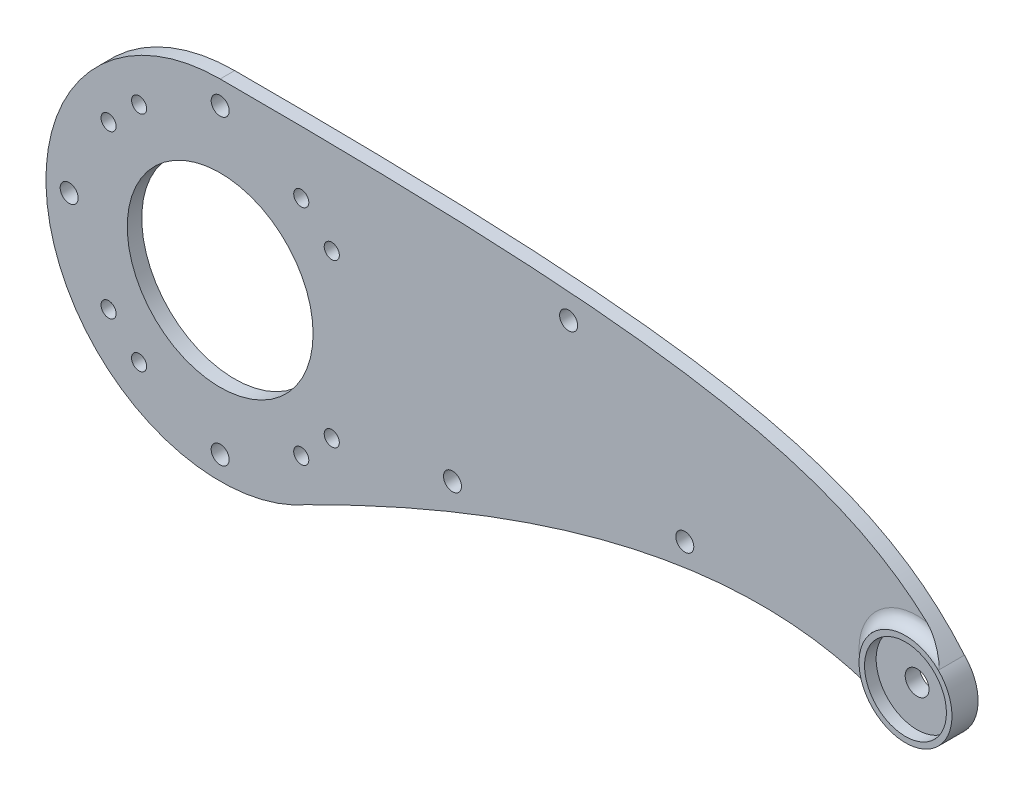
ISO-10303-21;
HEADER;
FILE_DESCRIPTION(('STEP AP214'),'2;1');
FILE_NAME('part.step','',(''),(''),'','','');
FILE_SCHEMA(('AUTOMOTIVE_DESIGN { 1 0 10303 214 1 1 1 1 }'));
ENDSEC;
DATA;
#1=APPLICATION_CONTEXT('core data for automotive mechanical design processes');
#2=APPLICATION_PROTOCOL_DEFINITION('international standard','automotive_design',2000,#1);
#3=PRODUCT_CONTEXT('',#1,'mechanical');
#4=PRODUCT('Part','Part','',(#3));
#5=PRODUCT_RELATED_PRODUCT_CATEGORY('part','',(#4));
#6=PRODUCT_DEFINITION_FORMATION('','',#4);
#7=PRODUCT_DEFINITION_CONTEXT('part definition',#1,'design');
#8=PRODUCT_DEFINITION('design','',#6,#7);
#9=PRODUCT_DEFINITION_SHAPE('','',#8);
#10=(LENGTH_UNIT() NAMED_UNIT(*) SI_UNIT(.MILLI.,.METRE.));
#11=(NAMED_UNIT(*) PLANE_ANGLE_UNIT() SI_UNIT($,.RADIAN.));
#12=(NAMED_UNIT(*) SI_UNIT($,.STERADIAN.) SOLID_ANGLE_UNIT());
#13=UNCERTAINTY_MEASURE_WITH_UNIT(LENGTH_MEASURE(1.E-05),#10,'distance_accuracy_value','');
#14=(GEOMETRIC_REPRESENTATION_CONTEXT(3) GLOBAL_UNCERTAINTY_ASSIGNED_CONTEXT((#13)) GLOBAL_UNIT_ASSIGNED_CONTEXT((#10,
#11,#12)) REPRESENTATION_CONTEXT('',''));
#15=CARTESIAN_POINT('',(0.,0.,0.));
#16=DIRECTION('',(0.,0.,1.));
#17=DIRECTION('',(1.,0.,0.));
#18=AXIS2_PLACEMENT_3D('',#15,#16,#17);
#19=CARTESIAN_POINT('',(86.7847382513976,24.9953267195614,2.5));
#20=DIRECTION('',(0.,0.,1.));
#21=DIRECTION('',(1.,0.,0.));
#22=AXIS2_PLACEMENT_3D('',#19,#20,#21);
#23=PLANE('',#22);
#24=CARTESIAN_POINT('',(120.,0.,2.5));
#25=DIRECTION('',(0.,0.,1.));
#26=DIRECTION('',(1.,0.,0.));
#27=AXIS2_PLACEMENT_3D('',#24,#25,#26);
#28=CIRCLE('',#27,2.04999999999999);
#29=CARTESIAN_POINT('',(122.05,0.,2.5));
#30=VERTEX_POINT('',#29);
#31=EDGE_CURVE('E300',#30,#30,#28,.T.);
#32=ORIENTED_EDGE('',*,*,#31,.F.);
#33=EDGE_LOOP('',(#32));
#34=FACE_BOUND('',#33,.T.);
#35=CARTESIAN_POINT('',(120.,0.,2.5));
#36=DIRECTION('',(0.,0.,1.));
#37=DIRECTION('',(1.,0.,0.));
#38=AXIS2_PLACEMENT_3D('',#35,#36,#37);
#39=CIRCLE('',#38,7.05000000000001);
#40=CARTESIAN_POINT('',(127.05,0.,2.5));
#41=VERTEX_POINT('',#40);
#42=EDGE_CURVE('E200',#41,#41,#39,.T.);
#43=ORIENTED_EDGE('',*,*,#42,.T.);
#44=EDGE_LOOP('',(#43));
#45=FACE_BOUND('',#44,.T.);
#46=ADVANCED_FACE('F46',(#34,#45),#23,.T.);
#47=CARTESIAN_POINT('',(15.0000000000001,-25.9807621135331,2.5));
#48=CARTESIAN_POINT('',(82.0010347276407,7.72178000758146,2.5));
#49=CARTESIAN_POINT('',(114.343145750508,-5.65685424949234,2.5));
#50=B_SPLINE_CURVE_WITH_KNOTS('',2,(#47,#48,#49),.UNSPECIFIED.,.F.,.F.,(3,3),(0.,1.),.UNSPECIFIED.);
#51=CARTESIAN_POINT('',(15.0000000000001,-25.9807621135331,2.5));
#52=VERTEX_POINT('',#51);
#53=CARTESIAN_POINT('',(111.041115038127,-4.44278969116528,2.5));
#54=VERTEX_POINT('',#53);
#55=EDGE_CURVE('E116',#52,#54,#50,.T.);
#56=ORIENTED_EDGE('',*,*,#55,.T.);
#57=CARTESIAN_POINT('',(120.,0.,2.5));
#58=DIRECTION('',(0.,0.,1.));
#59=DIRECTION('',(1.,0.,0.));
#60=AXIS2_PLACEMENT_3D('',#57,#58,#59);
#61=CIRCLE('',#60,9.99999999999999);
#62=CARTESIAN_POINT('',(121.63931092164,9.86471792309334,2.5));
#63=VERTEX_POINT('',#62);
#64=EDGE_CURVE('E73',#54,#63,#61,.F.);
#65=ORIENTED_EDGE('',*,*,#64,.T.);
#66=CARTESIAN_POINT('',(125.656854249492,5.65685424949235,2.5));
#67=CARTESIAN_POINT('',(109.540350587229,24.7685865023329,2.5));
#68=CARTESIAN_POINT('',(80.,30.,2.5));
#69=CARTESIAN_POINT('',(0.,30.,2.5));
#70=B_SPLINE_CURVE_WITH_KNOTS('',3,(#66,#67,#68,#69),.UNSPECIFIED.,.F.,.F.,(4,4),(0.,1.),.UNSPECIFIED.);
#71=CARTESIAN_POINT('',(0.,30.,2.5));
#72=VERTEX_POINT('',#71);
#73=EDGE_CURVE('E96',#63,#72,#70,.T.);
#74=ORIENTED_EDGE('',*,*,#73,.T.);
#75=CARTESIAN_POINT('',(0.,0.,2.5));
#76=DIRECTION('',(0.,0.,1.));
#77=DIRECTION('',(1.,0.,0.));
#78=AXIS2_PLACEMENT_3D('',#75,#76,#77);
#79=CIRCLE('',#78,30.);
#80=EDGE_CURVE('E100',#72,#52,#79,.T.);
#81=ORIENTED_EDGE('',*,*,#80,.T.);
#82=EDGE_LOOP('',(#56,#65,#74,#81));
#83=FACE_BOUND('',#82,.T.);
#84=CARTESIAN_POINT('',(80.,1.,2.5));
#85=DIRECTION('',(0.,0.,1.));
#86=DIRECTION('',(1.,0.,0.));
#87=AXIS2_PLACEMENT_3D('',#84,#85,#86);
#88=CIRCLE('',#87,1.54999999999999);
#89=CARTESIAN_POINT('',(81.55,1.,2.5));
#90=VERTEX_POINT('',#89);
#91=EDGE_CURVE('E212',#90,#90,#88,.T.);
#92=ORIENTED_EDGE('',*,*,#91,.F.);
#93=EDGE_LOOP('',(#92));
#94=FACE_BOUND('',#93,.T.);
#95=CARTESIAN_POINT('',(0.,26.,2.5));
#96=DIRECTION('',(0.,0.,1.));
#97=DIRECTION('',(1.,0.,0.));
#98=AXIS2_PLACEMENT_3D('',#95,#96,#97);
#99=CIRCLE('',#98,1.55);
#100=CARTESIAN_POINT('',(1.55,26.,2.5));
#101=VERTEX_POINT('',#100);
#102=EDGE_CURVE('E228',#101,#101,#99,.T.);
#103=ORIENTED_EDGE('',*,*,#102,.F.);
#104=EDGE_LOOP('',(#103));
#105=FACE_BOUND('',#104,.T.);
#106=CARTESIAN_POINT('',(-19.2141536164048,13.9598997419465,2.5));
#107=DIRECTION('',(0.,0.,1.));
#108=DIRECTION('',(1.,0.,0.));
#109=AXIS2_PLACEMENT_3D('',#106,#107,#108);
#110=CIRCLE('',#109,1.3);
#111=CARTESIAN_POINT('',(-17.9141536164048,13.9598997419465,2.5));
#112=VERTEX_POINT('',#111);
#113=EDGE_CURVE('E244',#112,#112,#110,.T.);
#114=ORIENTED_EDGE('',*,*,#113,.F.);
#115=EDGE_LOOP('',(#114));
#116=FACE_BOUND('',#115,.T.);
#117=CARTESIAN_POINT('',(-13.9598997419464,-19.2141536164049,2.5));
#118=DIRECTION('',(0.,0.,1.));
#119=DIRECTION('',(1.,0.,0.));
#120=AXIS2_PLACEMENT_3D('',#117,#118,#119);
#121=CIRCLE('',#120,1.3);
#122=CARTESIAN_POINT('',(-12.6598997419464,-19.2141536164049,2.5));
#123=VERTEX_POINT('',#122);
#124=EDGE_CURVE('E260',#123,#123,#121,.T.);
#125=ORIENTED_EDGE('',*,*,#124,.F.);
#126=EDGE_LOOP('',(#125));
#127=FACE_BOUND('',#126,.T.);
#128=CARTESIAN_POINT('',(19.2141536164049,-13.9598997419463,2.5));
#129=DIRECTION('',(0.,0.,1.));
#130=DIRECTION('',(1.,0.,0.));
#131=AXIS2_PLACEMENT_3D('',#128,#129,#130);
#132=CIRCLE('',#131,1.3);
#133=CARTESIAN_POINT('',(20.5141536164049,-13.9598997419463,2.5));
#134=VERTEX_POINT('',#133);
#135=EDGE_CURVE('E276',#134,#134,#132,.T.);
#136=ORIENTED_EDGE('',*,*,#135,.F.);
#137=EDGE_LOOP('',(#136));
#138=FACE_BOUND('',#137,.T.);
#139=CARTESIAN_POINT('',(-26.,0.,2.5));
#140=DIRECTION('',(0.,0.,1.));
#141=DIRECTION('',(1.,0.,0.));
#142=AXIS2_PLACEMENT_3D('',#139,#140,#141);
#143=CIRCLE('',#142,1.55);
#144=CARTESIAN_POINT('',(-24.45,0.,2.5));
#145=VERTEX_POINT('',#144);
#146=EDGE_CURVE('E292',#145,#145,#143,.T.);
#147=ORIENTED_EDGE('',*,*,#146,.F.);
#148=EDGE_LOOP('',(#147));
#149=FACE_BOUND('',#148,.T.);
#150=CARTESIAN_POINT('',(0.,0.,2.5));
#151=DIRECTION('',(0.,0.,1.));
#152=DIRECTION('',(1.,0.,0.));
#153=AXIS2_PLACEMENT_3D('',#150,#151,#152);
#154=CIRCLE('',#153,16.);
#155=CARTESIAN_POINT('',(16.,0.,2.5));
#156=VERTEX_POINT('',#155);
#157=EDGE_CURVE('E308',#156,#156,#154,.T.);
#158=ORIENTED_EDGE('',*,*,#157,.F.);
#159=EDGE_LOOP('',(#158));
#160=FACE_BOUND('',#159,.T.);
#161=CARTESIAN_POINT('',(19.2141536164051,13.9598997419461,2.5));
#162=DIRECTION('',(0.,0.,1.));
#163=DIRECTION('',(1.,0.,0.));
#164=AXIS2_PLACEMENT_3D('',#161,#162,#163);
#165=CIRCLE('',#164,1.3);
#166=CARTESIAN_POINT('',(20.5141536164051,13.9598997419461,2.5));
#167=VERTEX_POINT('',#166);
#168=EDGE_CURVE('E158',#167,#167,#165,.T.);
#169=ORIENTED_EDGE('',*,*,#168,.F.);
#170=EDGE_LOOP('',(#169));
#171=FACE_BOUND('',#170,.T.);
#172=CARTESIAN_POINT('',(13.9598997419463,19.214153616405,2.5));
#173=DIRECTION('',(0.,0.,1.));
#174=DIRECTION('',(1.,0.,0.));
#175=AXIS2_PLACEMENT_3D('',#172,#173,#174);
#176=CIRCLE('',#175,1.3);
#177=CARTESIAN_POINT('',(15.2598997419463,19.214153616405,2.5));
#178=VERTEX_POINT('',#177);
#179=EDGE_CURVE('E316',#178,#178,#176,.T.);
#180=ORIENTED_EDGE('',*,*,#179,.F.);
#181=EDGE_LOOP('',(#180));
#182=FACE_BOUND('',#181,.T.);
#183=CARTESIAN_POINT('',(13.9598997419461,-19.2141536164051,2.5));
#184=DIRECTION('',(0.,0.,1.));
#185=DIRECTION('',(1.,0.,0.));
#186=AXIS2_PLACEMENT_3D('',#183,#184,#185);
#187=CIRCLE('',#186,1.3);
#188=CARTESIAN_POINT('',(15.2598997419461,-19.2141536164051,2.5));
#189=VERTEX_POINT('',#188);
#190=EDGE_CURVE('E284',#189,#189,#187,.T.);
#191=ORIENTED_EDGE('',*,*,#190,.F.);
#192=EDGE_LOOP('',(#191));
#193=FACE_BOUND('',#192,.T.);
#194=CARTESIAN_POINT('',(-19.2141536164052,-13.959899741946,2.5));
#195=DIRECTION('',(0.,0.,1.));
#196=DIRECTION('',(1.,0.,0.));
#197=AXIS2_PLACEMENT_3D('',#194,#195,#196);
#198=CIRCLE('',#197,1.3);
#199=CARTESIAN_POINT('',(-17.9141536164052,-13.959899741946,2.5));
#200=VERTEX_POINT('',#199);
#201=EDGE_CURVE('E268',#200,#200,#198,.T.);
#202=ORIENTED_EDGE('',*,*,#201,.F.);
#203=EDGE_LOOP('',(#202));
#204=FACE_BOUND('',#203,.T.);
#205=CARTESIAN_POINT('',(-13.9598997419459,19.2141536164052,2.5));
#206=DIRECTION('',(0.,0.,1.));
#207=DIRECTION('',(1.,0.,0.));
#208=AXIS2_PLACEMENT_3D('',#205,#206,#207);
#209=CIRCLE('',#208,1.3);
#210=CARTESIAN_POINT('',(-12.6598997419459,19.2141536164052,2.5));
#211=VERTEX_POINT('',#210);
#212=EDGE_CURVE('E252',#211,#211,#209,.T.);
#213=ORIENTED_EDGE('',*,*,#212,.F.);
#214=EDGE_LOOP('',(#213));
#215=FACE_BOUND('',#214,.T.);
#216=CARTESIAN_POINT('',(40.,-10.,2.5));
#217=DIRECTION('',(0.,0.,1.));
#218=DIRECTION('',(1.,0.,0.));
#219=AXIS2_PLACEMENT_3D('',#216,#217,#218);
#220=CIRCLE('',#219,1.55);
#221=CARTESIAN_POINT('',(41.55,-10.,2.5));
#222=VERTEX_POINT('',#221);
#223=EDGE_CURVE('E236',#222,#222,#220,.T.);
#224=ORIENTED_EDGE('',*,*,#223,.F.);
#225=EDGE_LOOP('',(#224));
#226=FACE_BOUND('',#225,.T.);
#227=CARTESIAN_POINT('',(-2.72620909703935E-13,-26.,2.5));
#228=DIRECTION('',(0.,0.,1.));
#229=DIRECTION('',(1.,0.,0.));
#230=AXIS2_PLACEMENT_3D('',#227,#228,#229);
#231=CIRCLE('',#230,1.55);
#232=CARTESIAN_POINT('',(1.54999999999972,-26.,2.5));
#233=VERTEX_POINT('',#232);
#234=EDGE_CURVE('E220',#233,#233,#231,.T.);
#235=ORIENTED_EDGE('',*,*,#234,.F.);
#236=EDGE_LOOP('',(#235));
#237=FACE_BOUND('',#236,.T.);
#238=CARTESIAN_POINT('',(60.,24.,2.5));
#239=DIRECTION('',(0.,0.,1.));
#240=DIRECTION('',(1.,0.,0.));
#241=AXIS2_PLACEMENT_3D('',#238,#239,#240);
#242=CIRCLE('',#241,1.54999999999999);
#243=CARTESIAN_POINT('',(61.55,24.,2.5));
#244=VERTEX_POINT('',#243);
#245=EDGE_CURVE('E204',#244,#244,#242,.T.);
#246=ORIENTED_EDGE('',*,*,#245,.F.);
#247=EDGE_LOOP('',(#246));
#248=FACE_BOUND('',#247,.T.);
#249=ADVANCED_FACE('F98',(#83,#94,#105,#116,#127,#138,#149,#160,#171,#182,#193,#204,#215,#226,
#237,#248),#23,.T.);
#250=CARTESIAN_POINT('',(86.7847382513976,24.9953267195614,0.));
#251=DIRECTION('',(0.,0.,1.));
#252=DIRECTION('',(1.,0.,0.));
#253=AXIS2_PLACEMENT_3D('',#250,#251,#252);
#254=PLANE('',#253);
#255=CARTESIAN_POINT('',(125.656854249492,5.65685424949235,0.));
#256=CARTESIAN_POINT('',(109.540350587229,24.7685865023329,0.));
#257=CARTESIAN_POINT('',(80.,30.,0.));
#258=CARTESIAN_POINT('',(0.,30.,0.));
#259=B_SPLINE_CURVE_WITH_KNOTS('',3,(#255,#256,#257,#258),.UNSPECIFIED.,.F.,.F.,(4,4),(0.,1.),.UNSPECIFIED.);
#260=CARTESIAN_POINT('',(125.656854249492,5.65685424949235,0.));
#261=VERTEX_POINT('',#260);
#262=CARTESIAN_POINT('',(0.,30.,0.));
#263=VERTEX_POINT('',#262);
#264=EDGE_CURVE('E121',#261,#263,#259,.T.);
#265=ORIENTED_EDGE('',*,*,#264,.F.);
#266=CARTESIAN_POINT('',(120.,0.,0.));
#267=DIRECTION('',(0.,0.,1.));
#268=DIRECTION('',(-1.,0.,0.));
#269=AXIS2_PLACEMENT_3D('',#266,#267,#268);
#270=CIRCLE('',#269,7.99999999999999);
#271=CARTESIAN_POINT('',(114.343145750508,-5.65685424949234,0.));
#272=VERTEX_POINT('',#271);
#273=EDGE_CURVE('E106',#272,#261,#270,.T.);
#274=ORIENTED_EDGE('',*,*,#273,.F.);
#275=CARTESIAN_POINT('',(15.0000000000001,-25.9807621135331,0.));
#276=CARTESIAN_POINT('',(82.0010347276407,7.72178000758146,0.));
#277=CARTESIAN_POINT('',(114.343145750508,-5.65685424949234,0.));
#278=B_SPLINE_CURVE_WITH_KNOTS('',2,(#275,#276,#277),.UNSPECIFIED.,.F.,.F.,(3,3),(0.,1.),.UNSPECIFIED.);
#279=CARTESIAN_POINT('',(15.0000000000001,-25.9807621135331,0.));
#280=VERTEX_POINT('',#279);
#281=EDGE_CURVE('E164',#280,#272,#278,.T.);
#282=ORIENTED_EDGE('',*,*,#281,.F.);
#283=CARTESIAN_POINT('',(0.,0.,0.));
#284=DIRECTION('',(0.,0.,1.));
#285=DIRECTION('',(1.,0.,0.));
#286=AXIS2_PLACEMENT_3D('',#283,#284,#285);
#287=CIRCLE('',#286,30.);
#288=EDGE_CURVE('E157',#263,#280,#287,.T.);
#289=ORIENTED_EDGE('',*,*,#288,.F.);
#290=EDGE_LOOP('',(#265,#274,#282,#289));
#291=FACE_BOUND('',#290,.T.);
#292=CARTESIAN_POINT('',(19.2141536164051,13.9598997419461,0.));
#293=DIRECTION('',(0.,0.,1.));
#294=DIRECTION('',(1.,0.,0.));
#295=AXIS2_PLACEMENT_3D('',#292,#293,#294);
#296=CIRCLE('',#295,1.3);
#297=CARTESIAN_POINT('',(20.5141536164051,13.9598997419461,0.));
#298=VERTEX_POINT('',#297);
#299=EDGE_CURVE('E320',#298,#298,#296,.T.);
#300=ORIENTED_EDGE('',*,*,#299,.T.);
#301=EDGE_LOOP('',(#300));
#302=FACE_BOUND('',#301,.T.);
#303=CARTESIAN_POINT('',(13.9598997419463,19.214153616405,0.));
#304=DIRECTION('',(0.,0.,1.));
#305=DIRECTION('',(1.,0.,0.));
#306=AXIS2_PLACEMENT_3D('',#303,#304,#305);
#307=CIRCLE('',#306,1.3);
#308=CARTESIAN_POINT('',(15.2598997419463,19.214153616405,0.));
#309=VERTEX_POINT('',#308);
#310=EDGE_CURVE('E312',#309,#309,#307,.T.);
#311=ORIENTED_EDGE('',*,*,#310,.T.);
#312=EDGE_LOOP('',(#311));
#313=FACE_BOUND('',#312,.T.);
#314=CARTESIAN_POINT('',(0.,0.,0.));
#315=DIRECTION('',(0.,0.,1.));
#316=DIRECTION('',(1.,0.,0.));
#317=AXIS2_PLACEMENT_3D('',#314,#315,#316);
#318=CIRCLE('',#317,16.);
#319=CARTESIAN_POINT('',(16.,0.,0.));
#320=VERTEX_POINT('',#319);
#321=EDGE_CURVE('E304',#320,#320,#318,.T.);
#322=ORIENTED_EDGE('',*,*,#321,.T.);
#323=EDGE_LOOP('',(#322));
#324=FACE_BOUND('',#323,.T.);
#325=CARTESIAN_POINT('',(120.,0.,0.));
#326=DIRECTION('',(0.,0.,1.));
#327=DIRECTION('',(1.,0.,0.));
#328=AXIS2_PLACEMENT_3D('',#325,#326,#327);
#329=CIRCLE('',#328,2.04999999999999);
#330=CARTESIAN_POINT('',(122.05,0.,0.));
#331=VERTEX_POINT('',#330);
#332=EDGE_CURVE('E296',#331,#331,#329,.T.);
#333=ORIENTED_EDGE('',*,*,#332,.T.);
#334=EDGE_LOOP('',(#333));
#335=FACE_BOUND('',#334,.T.);
#336=CARTESIAN_POINT('',(-26.,0.,0.));
#337=DIRECTION('',(0.,0.,1.));
#338=DIRECTION('',(1.,0.,0.));
#339=AXIS2_PLACEMENT_3D('',#336,#337,#338);
#340=CIRCLE('',#339,1.55);
#341=CARTESIAN_POINT('',(-24.45,0.,0.));
#342=VERTEX_POINT('',#341);
#343=EDGE_CURVE('E288',#342,#342,#340,.T.);
#344=ORIENTED_EDGE('',*,*,#343,.T.);
#345=EDGE_LOOP('',(#344));
#346=FACE_BOUND('',#345,.T.);
#347=CARTESIAN_POINT('',(13.9598997419461,-19.2141536164051,0.));
#348=DIRECTION('',(0.,0.,1.));
#349=DIRECTION('',(1.,0.,0.));
#350=AXIS2_PLACEMENT_3D('',#347,#348,#349);
#351=CIRCLE('',#350,1.3);
#352=CARTESIAN_POINT('',(15.2598997419461,-19.2141536164051,0.));
#353=VERTEX_POINT('',#352);
#354=EDGE_CURVE('E280',#353,#353,#351,.T.);
#355=ORIENTED_EDGE('',*,*,#354,.T.);
#356=EDGE_LOOP('',(#355));
#357=FACE_BOUND('',#356,.T.);
#358=CARTESIAN_POINT('',(19.2141536164049,-13.9598997419463,0.));
#359=DIRECTION('',(0.,0.,1.));
#360=DIRECTION('',(1.,0.,0.));
#361=AXIS2_PLACEMENT_3D('',#358,#359,#360);
#362=CIRCLE('',#361,1.3);
#363=CARTESIAN_POINT('',(20.5141536164049,-13.9598997419463,0.));
#364=VERTEX_POINT('',#363);
#365=EDGE_CURVE('E272',#364,#364,#362,.T.);
#366=ORIENTED_EDGE('',*,*,#365,.T.);
#367=EDGE_LOOP('',(#366));
#368=FACE_BOUND('',#367,.T.);
#369=CARTESIAN_POINT('',(-19.2141536164052,-13.959899741946,0.));
#370=DIRECTION('',(0.,0.,1.));
#371=DIRECTION('',(1.,0.,0.));
#372=AXIS2_PLACEMENT_3D('',#369,#370,#371);
#373=CIRCLE('',#372,1.3);
#374=CARTESIAN_POINT('',(-17.9141536164052,-13.959899741946,0.));
#375=VERTEX_POINT('',#374);
#376=EDGE_CURVE('E264',#375,#375,#373,.T.);
#377=ORIENTED_EDGE('',*,*,#376,.T.);
#378=EDGE_LOOP('',(#377));
#379=FACE_BOUND('',#378,.T.);
#380=CARTESIAN_POINT('',(-13.9598997419464,-19.2141536164049,0.));
#381=DIRECTION('',(0.,0.,1.));
#382=DIRECTION('',(1.,0.,0.));
#383=AXIS2_PLACEMENT_3D('',#380,#381,#382);
#384=CIRCLE('',#383,1.3);
#385=CARTESIAN_POINT('',(-12.6598997419464,-19.2141536164049,0.));
#386=VERTEX_POINT('',#385);
#387=EDGE_CURVE('E256',#386,#386,#384,.T.);
#388=ORIENTED_EDGE('',*,*,#387,.T.);
#389=EDGE_LOOP('',(#388));
#390=FACE_BOUND('',#389,.T.);
#391=CARTESIAN_POINT('',(-13.9598997419459,19.2141536164052,0.));
#392=DIRECTION('',(0.,0.,1.));
#393=DIRECTION('',(1.,0.,0.));
#394=AXIS2_PLACEMENT_3D('',#391,#392,#393);
#395=CIRCLE('',#394,1.3);
#396=CARTESIAN_POINT('',(-12.6598997419459,19.2141536164052,0.));
#397=VERTEX_POINT('',#396);
#398=EDGE_CURVE('E248',#397,#397,#395,.T.);
#399=ORIENTED_EDGE('',*,*,#398,.T.);
#400=EDGE_LOOP('',(#399));
#401=FACE_BOUND('',#400,.T.);
#402=CARTESIAN_POINT('',(-19.2141536164048,13.9598997419465,0.));
#403=DIRECTION('',(0.,0.,1.));
#404=DIRECTION('',(1.,0.,0.));
#405=AXIS2_PLACEMENT_3D('',#402,#403,#404);
#406=CIRCLE('',#405,1.3);
#407=CARTESIAN_POINT('',(-17.9141536164048,13.9598997419465,0.));
#408=VERTEX_POINT('',#407);
#409=EDGE_CURVE('E240',#408,#408,#406,.T.);
#410=ORIENTED_EDGE('',*,*,#409,.T.);
#411=EDGE_LOOP('',(#410));
#412=FACE_BOUND('',#411,.T.);
#413=CARTESIAN_POINT('',(40.,-10.,0.));
#414=DIRECTION('',(0.,0.,1.));
#415=DIRECTION('',(1.,0.,0.));
#416=AXIS2_PLACEMENT_3D('',#413,#414,#415);
#417=CIRCLE('',#416,1.55);
#418=CARTESIAN_POINT('',(41.55,-10.,0.));
#419=VERTEX_POINT('',#418);
#420=EDGE_CURVE('E232',#419,#419,#417,.T.);
#421=ORIENTED_EDGE('',*,*,#420,.T.);
#422=EDGE_LOOP('',(#421));
#423=FACE_BOUND('',#422,.T.);
#424=CARTESIAN_POINT('',(0.,26.,0.));
#425=DIRECTION('',(0.,0.,1.));
#426=DIRECTION('',(1.,0.,0.));
#427=AXIS2_PLACEMENT_3D('',#424,#425,#426);
#428=CIRCLE('',#427,1.55);
#429=CARTESIAN_POINT('',(1.55,26.,0.));
#430=VERTEX_POINT('',#429);
#431=EDGE_CURVE('E224',#430,#430,#428,.T.);
#432=ORIENTED_EDGE('',*,*,#431,.T.);
#433=EDGE_LOOP('',(#432));
#434=FACE_BOUND('',#433,.T.);
#435=CARTESIAN_POINT('',(-2.72620909703935E-13,-26.,0.));
#436=DIRECTION('',(0.,0.,1.));
#437=DIRECTION('',(1.,0.,0.));
#438=AXIS2_PLACEMENT_3D('',#435,#436,#437);
#439=CIRCLE('',#438,1.55);
#440=CARTESIAN_POINT('',(1.54999999999972,-26.,0.));
#441=VERTEX_POINT('',#440);
#442=EDGE_CURVE('E216',#441,#441,#439,.T.);
#443=ORIENTED_EDGE('',*,*,#442,.T.);
#444=EDGE_LOOP('',(#443));
#445=FACE_BOUND('',#444,.T.);
#446=CARTESIAN_POINT('',(80.,1.,0.));
#447=DIRECTION('',(0.,0.,1.));
#448=DIRECTION('',(1.,0.,0.));
#449=AXIS2_PLACEMENT_3D('',#446,#447,#448);
#450=CIRCLE('',#449,1.54999999999999);
#451=CARTESIAN_POINT('',(81.55,1.,0.));
#452=VERTEX_POINT('',#451);
#453=EDGE_CURVE('E208',#452,#452,#450,.T.);
#454=ORIENTED_EDGE('',*,*,#453,.T.);
#455=EDGE_LOOP('',(#454));
#456=FACE_BOUND('',#455,.T.);
#457=CARTESIAN_POINT('',(60.,24.,0.));
#458=DIRECTION('',(0.,0.,1.));
#459=DIRECTION('',(1.,0.,0.));
#460=AXIS2_PLACEMENT_3D('',#457,#458,#459);
#461=CIRCLE('',#460,1.54999999999999);
#462=CARTESIAN_POINT('',(61.55,24.,0.));
#463=VERTEX_POINT('',#462);
#464=EDGE_CURVE('E198',#463,#463,#461,.T.);
#465=ORIENTED_EDGE('',*,*,#464,.T.);
#466=EDGE_LOOP('',(#465));
#467=FACE_BOUND('',#466,.T.);
#468=ADVANCED_FACE('F185',(#291,#302,#313,#324,#335,#346,#357,#368,#379,#390,#401,#412,#423,
#434,#445,#456,#467),#254,.F.);
#469=DIRECTION('',(0.,0.,-1.));
#470=VECTOR('',#469,1.);
#471=SURFACE_OF_LINEAR_EXTRUSION('',#70,#470);
#472=ORIENTED_EDGE('',*,*,#264,.T.);
#473=DIRECTION('',(0.,0.,-1.));
#474=VECTOR('',#473,1.);
#475=CARTESIAN_POINT('',(0.,30.,2.5));
#476=LINE('',#475,#474);
#477=EDGE_CURVE('E111',#72,#263,#476,.T.);
#478=ORIENTED_EDGE('',*,*,#477,.F.);
#479=ORIENTED_EDGE('',*,*,#73,.F.);
#480=CARTESIAN_POINT('',(121.63931092164,9.86471792309293,2.5));
#481=CARTESIAN_POINT('',(121.726683439903,9.78407825544486,2.500012010474));
#482=CARTESIAN_POINT('',(121.813715188996,9.70311415866969,2.5031901707191));
#483=CARTESIAN_POINT('',(121.986889281124,9.54074609120689,2.51532558306157));
#484=CARTESIAN_POINT('',(122.073032029421,9.45934234928506,2.52428007194798));
#485=CARTESIAN_POINT('',(122.244122148612,9.29639984402405,2.54739141990704));
#486=CARTESIAN_POINT('',(122.329071670458,9.21486173505681,2.5615371850044));
#487=CARTESIAN_POINT('',(122.497866752785,9.0515922626852,2.59456373006933));
#488=CARTESIAN_POINT('',(122.581712167234,8.96986087537073,2.61344512988946));
#489=CARTESIAN_POINT('',(122.830350151426,8.72563357307815,2.67625574333535));
#490=CARTESIAN_POINT('',(122.993416048835,8.56298790622396,2.72652186863386));
#491=CARTESIAN_POINT('',(123.314656723936,8.23779972450338,2.84113091047001));
#492=CARTESIAN_POINT('',(123.472829479627,8.07525727876379,2.90547955995671));
#493=CARTESIAN_POINT('',(123.756433707945,7.77957630415604,3.03337118378579));
#494=CARTESIAN_POINT('',(123.882666982689,7.64637149400865,3.09500508504249));
#495=CARTESIAN_POINT('',(124.131926938167,7.38026115846515,3.22520376179772));
#496=CARTESIAN_POINT('',(124.254952534123,7.24735574785391,3.29377084469331));
#497=CARTESIAN_POINT('',(124.459136406003,7.02423930215196,3.41436578609601));
#498=CARTESIAN_POINT('',(124.541157968166,6.93390251511348,3.46471213777887));
#499=CARTESIAN_POINT('',(124.703662690338,6.75354018756699,3.5683031297045));
#500=CARTESIAN_POINT('',(124.784146169029,6.6635145858201,3.62154716057144));
#501=CARTESIAN_POINT('',(124.916701506813,6.51411710900489,3.71285332149441));
#502=CARTESIAN_POINT('',(124.969238502732,6.45460318884434,3.75000962072477));
#503=CARTESIAN_POINT('',(125.0734892098,6.33591924382252,3.82604099947374));
#504=CARTESIAN_POINT('',(125.125202760481,6.27674928738373,3.86491640856096));
#505=CARTESIAN_POINT('',(125.210030199324,6.17921569921567,3.93130117403029));
#506=CARTESIAN_POINT('',(125.243449652073,6.14066514494547,3.95814443854989));
#507=CARTESIAN_POINT('',(125.309663117385,6.0640430886596,4.01319148206935));
#508=CARTESIAN_POINT('',(125.342457501473,6.02597130696242,4.04139441534552));
#509=CARTESIAN_POINT('',(125.396110923805,5.9634911560655,4.08989360539746));
#510=CARTESIAN_POINT('',(125.417225532532,5.93885178946008,4.10960546733878));
#511=CARTESIAN_POINT('',(125.458920743942,5.89009931767734,4.15032751970729));
#512=CARTESIAN_POINT('',(125.479500433485,5.86598712230007,4.17133974659813));
#513=CARTESIAN_POINT('',(125.518654947739,5.82002354650381,4.21404927121575));
#514=CARTESIAN_POINT('',(125.537277688083,5.79812090846446,4.23564421911785));
#515=CARTESIAN_POINT('',(125.564078248059,5.76654722770949,4.27005745039278));
#516=CARTESIAN_POINT('',(125.572815325241,5.75624493715403,4.28185355183185));
#517=CARTESIAN_POINT('',(125.589737672072,5.7362750851622,4.30633731839954));
#518=CARTESIAN_POINT('',(125.597923473143,5.72660691268723,4.31902410010636));
#519=CARTESIAN_POINT('',(125.612061064876,5.70989709436978,4.34319809031124));
#520=CARTESIAN_POINT('',(125.618150155912,5.70269544513714,4.35449206079687));
#521=CARTESIAN_POINT('',(125.629482492821,5.68928559434745,4.37807957763342));
#522=CARTESIAN_POINT('',(125.634725980769,5.68307710847743,4.39037283639272));
#523=CARTESIAN_POINT('',(125.642938513663,5.67334930757751,4.41338164903866));
#524=CARTESIAN_POINT('',(125.646154031402,5.66953897356833,4.42388215762532));
#525=CARTESIAN_POINT('',(125.651451072221,5.66326075581921,4.44553444562219));
#526=CARTESIAN_POINT('',(125.653537171348,5.66078745490466,4.45668339113767));
#527=CARTESIAN_POINT('',(125.655551390409,5.65839919299556,4.4732918561467));
#528=CARTESIAN_POINT('',(125.656036821537,5.65782357606964,4.47859487985208));
#529=CARTESIAN_POINT('',(125.656689479772,5.65704964213745,4.48926389356007));
#530=CARTESIAN_POINT('',(125.656855730701,5.65685248260137,4.49463002638705));
#531=CARTESIAN_POINT('',(125.656854249492,5.65685424949235,4.50000000000001));
#532=B_SPLINE_CURVE_WITH_KNOTS('',3,(#480,#481,#482,#483,#484,#485,#486,#487,#488,#489,#490,
#491,#492,#493,#494,#495,#496,#497,#498,#499,#500,#501,#502,#503,#504,#505,#506,#507,#508,#509,
#510,#511,#512,#513,#514,#515,#516,#517,#518,#519,#520,#521,#522,#523,#524,#525,#526,#527,#528,
#529,#530,#531),.UNSPECIFIED.,.F.,.F.,(4,2,2,2,2,2,2,2,2,2,2,2,2,2,2,2,2,2,2,2,2,2,2,2,2,4),(0.,
0.356606710058375,0.713042957243267,1.06872187918794,1.42444738066492,2.13102942859389,
2.83789966059794,3.41851088595326,3.99931598158324,4.39527062336396,4.79114231608412,
5.05407973882925,5.31706778941117,5.49000593152514,5.66283785884055,5.77671722471544,
5.89077968276259,5.99852660127467,6.0523012172374,6.10602323046997,6.15010550376775,
6.19417513495829,6.22893835300804,6.26355964684057,6.27960746217335,6.29570428026587),.UNSPECIFIED.);
#533=CARTESIAN_POINT('',(125.656854249492,5.65685424949237,4.5));
#534=VERTEX_POINT('',#533);
#535=EDGE_CURVE('E11',#63,#534,#532,.T.);
#536=ORIENTED_EDGE('',*,*,#535,.T.);
#537=DIRECTION('',(0.,0.,-1.));
#538=VECTOR('',#537,1.);
#539=CARTESIAN_POINT('',(125.656854249492,5.65685424949235,2.5));
#540=LINE('',#539,#538);
#541=EDGE_CURVE('E149',#534,#261,#540,.T.);
#542=ORIENTED_EDGE('',*,*,#541,.T.);
#543=EDGE_LOOP('',(#472,#478,#479,#536,#542));
#544=FACE_BOUND('',#543,.T.);
#545=ADVANCED_FACE('F118',(#544),#471,.F.);
#546=CARTESIAN_POINT('',(0.,0.,2.5));
#547=DIRECTION('',(0.,0.,-1.));
#548=DIRECTION('',(-1.,0.,0.));
#549=AXIS2_PLACEMENT_3D('',#546,#547,#548);
#550=CYLINDRICAL_SURFACE('',#549,30.);
#551=ORIENTED_EDGE('',*,*,#288,.T.);
#552=DIRECTION('',(0.,0.,-1.));
#553=VECTOR('',#552,1.);
#554=CARTESIAN_POINT('',(15.0000000000001,-25.9807621135331,2.5));
#555=LINE('',#554,#553);
#556=EDGE_CURVE('E114',#52,#280,#555,.T.);
#557=ORIENTED_EDGE('',*,*,#556,.F.);
#558=ORIENTED_EDGE('',*,*,#80,.F.);
#559=ORIENTED_EDGE('',*,*,#477,.T.);
#560=EDGE_LOOP('',(#551,#557,#558,#559));
#561=FACE_BOUND('',#560,.T.);
#562=ADVANCED_FACE('F110',(#561),#550,.T.);
#563=DIRECTION('',(0.,0.,-1.));
#564=VECTOR('',#563,1.);
#565=SURFACE_OF_LINEAR_EXTRUSION('',#50,#564);
#566=ORIENTED_EDGE('',*,*,#281,.T.);
#567=DIRECTION('',(0.,0.,-1.));
#568=VECTOR('',#567,1.);
#569=CARTESIAN_POINT('',(114.343145750508,-5.65685424949234,2.5));
#570=LINE('',#569,#568);
#571=CARTESIAN_POINT('',(114.343145750508,-5.65685424949236,4.5));
#572=VERTEX_POINT('',#571);
#573=EDGE_CURVE('E127',#572,#272,#570,.T.);
#574=ORIENTED_EDGE('',*,*,#573,.F.);
#575=CARTESIAN_POINT('',(114.343145750508,-5.65685424949234,4.5));
#576=CARTESIAN_POINT('',(114.343161024307,-5.65686079518055,4.47476283387903));
#577=CARTESIAN_POINT('',(114.341994110364,-5.65637786465062,4.44953598037624));
#578=CARTESIAN_POINT('',(114.337415832181,-5.65448435723702,4.39936570467808));
#579=CARTESIAN_POINT('',(114.334008478507,-5.65307543794902,4.37442185689294));
#580=CARTESIAN_POINT('',(114.325138465581,-5.64940985287229,4.32537578687995));
#581=CARTESIAN_POINT('',(114.319708827023,-5.64716680789935,4.30126650194322));
#582=CARTESIAN_POINT('',(114.306977197062,-5.64191135896927,4.25362927875014));
#583=CARTESIAN_POINT('',(114.299674280755,-5.63889857496752,4.23010163397963));
#584=CARTESIAN_POINT('',(114.269887202892,-5.62662200791019,4.14524180402111));
#585=CARTESIAN_POINT('',(114.242320773131,-5.61528139339423,4.08596321208198));
#586=CARTESIAN_POINT('',(114.178973609901,-5.58932270688338,3.97244170738403));
#587=CARTESIAN_POINT('',(114.143132386532,-5.57468051929485,3.91824022593702));
#588=CARTESIAN_POINT('',(114.067857073383,-5.5440661646162,3.81715826915876));
#589=CARTESIAN_POINT('',(114.028683431885,-5.52819367767663,3.77004967434956));
#590=CARTESIAN_POINT('',(113.946751629587,-5.49514914679998,3.67952005792809));
#591=CARTESIAN_POINT('',(113.903990141474,-5.4779758980237,3.63610253617257));
#592=CARTESIAN_POINT('',(113.815749430712,-5.44271126229352,3.55242263473783));
#593=CARTESIAN_POINT('',(113.770266722973,-5.42461870263887,3.51216446059756));
#594=CARTESIAN_POINT('',(113.677192627917,-5.38778455512546,3.43446143569266));
#595=CARTESIAN_POINT('',(113.629600462752,-5.36904272841962,3.39701763666321));
#596=CARTESIAN_POINT('',(113.531183111535,-5.33049226050475,3.32353937783104));
#597=CARTESIAN_POINT('',(113.480303325712,-5.31066860315058,3.28758619602896));
#598=CARTESIAN_POINT('',(113.377005582073,-5.27065021081347,3.21817567833895));
#599=CARTESIAN_POINT('',(113.324587346269,-5.25045540901689,3.18471879743189));
#600=CARTESIAN_POINT('',(113.165271375844,-5.18943583516258,3.08783200197803));
#601=CARTESIAN_POINT('',(113.056368872552,-5.14819806205474,3.02792737138879));
#602=CARTESIAN_POINT('',(112.834420318131,-5.06518973845727,2.91711898493238));
#603=CARTESIAN_POINT('',(112.721377253717,-5.02341958563808,2.86620888959551));
#604=CARTESIAN_POINT('',(112.491713455576,-4.93964388599861,2.77345164447341));
#605=CARTESIAN_POINT('',(112.375093023319,-4.89763835925622,2.73160373338411));
#606=CARTESIAN_POINT('',(112.158733539339,-4.82074057747302,2.66372128382472));
#607=CARTESIAN_POINT('',(112.059458345349,-4.78584150502438,2.63621055871317));
#608=CARTESIAN_POINT('',(111.859170564434,-4.71622842680357,2.58826426051812));
#609=CARTESIAN_POINT('',(111.75815846319,-4.68151437274119,2.56782674231142));
#610=CARTESIAN_POINT('',(111.554978669957,-4.61249730525125,2.53461706517386));
#611=CARTESIAN_POINT('',(111.452814029914,-4.5781935522096,2.52182804322605));
#612=CARTESIAN_POINT('',(111.247529775145,-4.51007226851621,2.5045234684915));
#613=CARTESIAN_POINT('',(111.144409372326,-4.4762552113533,2.50001549475312));
#614=CARTESIAN_POINT('',(111.041115038127,-4.44278969116529,2.5));
#615=B_SPLINE_CURVE_WITH_KNOTS('',3,(#575,#576,#577,#578,#579,#580,#581,#582,#583,#584,#585,
#586,#587,#588,#589,#590,#591,#592,#593,#594,#595,#596,#597,#598,#599,#600,#601,#602,#603,#604,
#605,#606,#607,#608,#609,#610,#611,#612,#613,#614),.UNSPECIFIED.,.F.,.F.,(4,2,2,2,2,2,2,2,2,2,2,
2,2,2,2,2,2,2,2,4),(0.,0.0756633516173978,0.151191627202028,0.225537164845405,0.29991948041777,
0.497732786017902,0.697040679551288,0.886629019517422,1.07639516647789,1.26640977902827,
1.45649505080334,1.65255438962392,1.84864937576585,2.24105908624771,2.6331911080396,
3.02529017446305,3.3513686057402,3.67735729446534,4.0026245845559,4.32818942038815),.UNSPECIFIED.);
#616=EDGE_CURVE('E60',#572,#54,#615,.T.);
#617=ORIENTED_EDGE('',*,*,#616,.T.);
#618=ORIENTED_EDGE('',*,*,#55,.F.);
#619=ORIENTED_EDGE('',*,*,#556,.T.);
#620=EDGE_LOOP('',(#566,#574,#617,#618,#619));
#621=FACE_BOUND('',#620,.T.);
#622=ADVANCED_FACE('F136',(#621),#565,.F.);
#623=CARTESIAN_POINT('',(120.,0.,2.5));
#624=DIRECTION('',(0.,0.,-1.));
#625=DIRECTION('',(-1.,0.,0.));
#626=AXIS2_PLACEMENT_3D('',#623,#624,#625);
#627=CYLINDRICAL_SURFACE('',#626,7.99999999999999);
#628=CARTESIAN_POINT('',(120.,0.,4.5));
#629=DIRECTION('',(0.,0.,1.));
#630=DIRECTION('',(1.,0.,0.));
#631=AXIS2_PLACEMENT_3D('',#628,#629,#630);
#632=CIRCLE('',#631,8.00000000000001);
#633=EDGE_CURVE('E181',#572,#534,#632,.T.);
#634=ORIENTED_EDGE('',*,*,#633,.F.);
#635=ORIENTED_EDGE('',*,*,#573,.T.);
#636=ORIENTED_EDGE('',*,*,#273,.T.);
#637=ORIENTED_EDGE('',*,*,#541,.F.);
#638=EDGE_LOOP('',(#634,#635,#636,#637));
#639=FACE_BOUND('',#638,.T.);
#640=ADVANCED_FACE('F142',(#639),#627,.T.);
#641=CARTESIAN_POINT('',(19.2141536164051,13.9598997419461,2.5));
#642=DIRECTION('',(0.,0.,-1.));
#643=DIRECTION('',(-1.,0.,0.));
#644=AXIS2_PLACEMENT_3D('',#641,#642,#643);
#645=CYLINDRICAL_SURFACE('',#644,1.3);
#646=ORIENTED_EDGE('',*,*,#168,.T.);
#647=EDGE_LOOP('',(#646));
#648=FACE_BOUND('',#647,.T.);
#649=ORIENTED_EDGE('',*,*,#299,.F.);
#650=EDGE_LOOP('',(#649));
#651=FACE_BOUND('',#650,.T.);
#652=ADVANCED_FACE('F352',(#648,#651),#645,.F.);
#653=CARTESIAN_POINT('',(13.9598997419463,19.214153616405,2.5));
#654=DIRECTION('',(0.,0.,-1.));
#655=DIRECTION('',(-1.,0.,0.));
#656=AXIS2_PLACEMENT_3D('',#653,#654,#655);
#657=CYLINDRICAL_SURFACE('',#656,1.3);
#658=ORIENTED_EDGE('',*,*,#179,.T.);
#659=EDGE_LOOP('',(#658));
#660=FACE_BOUND('',#659,.T.);
#661=ORIENTED_EDGE('',*,*,#310,.F.);
#662=EDGE_LOOP('',(#661));
#663=FACE_BOUND('',#662,.T.);
#664=ADVANCED_FACE('F355',(#660,#663),#657,.F.);
#665=CARTESIAN_POINT('',(0.,0.,2.5));
#666=DIRECTION('',(0.,0.,-1.));
#667=DIRECTION('',(-1.,0.,0.));
#668=AXIS2_PLACEMENT_3D('',#665,#666,#667);
#669=CYLINDRICAL_SURFACE('',#668,16.);
#670=ORIENTED_EDGE('',*,*,#157,.T.);
#671=EDGE_LOOP('',(#670));
#672=FACE_BOUND('',#671,.T.);
#673=ORIENTED_EDGE('',*,*,#321,.F.);
#674=EDGE_LOOP('',(#673));
#675=FACE_BOUND('',#674,.T.);
#676=ADVANCED_FACE('F359',(#672,#675),#669,.F.);
#677=CARTESIAN_POINT('',(120.,0.,2.5));
#678=DIRECTION('',(0.,0.,-1.));
#679=DIRECTION('',(-1.,0.,0.));
#680=AXIS2_PLACEMENT_3D('',#677,#678,#679);
#681=CYLINDRICAL_SURFACE('',#680,2.04999999999999);
#682=ORIENTED_EDGE('',*,*,#31,.T.);
#683=EDGE_LOOP('',(#682));
#684=FACE_BOUND('',#683,.T.);
#685=ORIENTED_EDGE('',*,*,#332,.F.);
#686=EDGE_LOOP('',(#685));
#687=FACE_BOUND('',#686,.T.);
#688=ADVANCED_FACE('F363',(#684,#687),#681,.F.);
#689=CARTESIAN_POINT('',(-26.,0.,2.5));
#690=DIRECTION('',(0.,0.,-1.));
#691=DIRECTION('',(-1.,0.,0.));
#692=AXIS2_PLACEMENT_3D('',#689,#690,#691);
#693=CYLINDRICAL_SURFACE('',#692,1.55);
#694=ORIENTED_EDGE('',*,*,#146,.T.);
#695=EDGE_LOOP('',(#694));
#696=FACE_BOUND('',#695,.T.);
#697=ORIENTED_EDGE('',*,*,#343,.F.);
#698=EDGE_LOOP('',(#697));
#699=FACE_BOUND('',#698,.T.);
#700=ADVANCED_FACE('F367',(#696,#699),#693,.F.);
#701=CARTESIAN_POINT('',(13.9598997419461,-19.2141536164051,2.5));
#702=DIRECTION('',(0.,0.,-1.));
#703=DIRECTION('',(-1.,0.,0.));
#704=AXIS2_PLACEMENT_3D('',#701,#702,#703);
#705=CYLINDRICAL_SURFACE('',#704,1.3);
#706=ORIENTED_EDGE('',*,*,#190,.T.);
#707=EDGE_LOOP('',(#706));
#708=FACE_BOUND('',#707,.T.);
#709=ORIENTED_EDGE('',*,*,#354,.F.);
#710=EDGE_LOOP('',(#709));
#711=FACE_BOUND('',#710,.T.);
#712=ADVANCED_FACE('F371',(#708,#711),#705,.F.);
#713=CARTESIAN_POINT('',(19.2141536164049,-13.9598997419463,2.5));
#714=DIRECTION('',(0.,0.,-1.));
#715=DIRECTION('',(-1.,0.,0.));
#716=AXIS2_PLACEMENT_3D('',#713,#714,#715);
#717=CYLINDRICAL_SURFACE('',#716,1.3);
#718=ORIENTED_EDGE('',*,*,#135,.T.);
#719=EDGE_LOOP('',(#718));
#720=FACE_BOUND('',#719,.T.);
#721=ORIENTED_EDGE('',*,*,#365,.F.);
#722=EDGE_LOOP('',(#721));
#723=FACE_BOUND('',#722,.T.);
#724=ADVANCED_FACE('F375',(#720,#723),#717,.F.);
#725=CARTESIAN_POINT('',(-19.2141536164052,-13.959899741946,2.5));
#726=DIRECTION('',(0.,0.,-1.));
#727=DIRECTION('',(-1.,0.,0.));
#728=AXIS2_PLACEMENT_3D('',#725,#726,#727);
#729=CYLINDRICAL_SURFACE('',#728,1.3);
#730=ORIENTED_EDGE('',*,*,#201,.T.);
#731=EDGE_LOOP('',(#730));
#732=FACE_BOUND('',#731,.T.);
#733=ORIENTED_EDGE('',*,*,#376,.F.);
#734=EDGE_LOOP('',(#733));
#735=FACE_BOUND('',#734,.T.);
#736=ADVANCED_FACE('F379',(#732,#735),#729,.F.);
#737=CARTESIAN_POINT('',(-13.9598997419464,-19.2141536164049,2.5));
#738=DIRECTION('',(0.,0.,-1.));
#739=DIRECTION('',(-1.,0.,0.));
#740=AXIS2_PLACEMENT_3D('',#737,#738,#739);
#741=CYLINDRICAL_SURFACE('',#740,1.3);
#742=ORIENTED_EDGE('',*,*,#124,.T.);
#743=EDGE_LOOP('',(#742));
#744=FACE_BOUND('',#743,.T.);
#745=ORIENTED_EDGE('',*,*,#387,.F.);
#746=EDGE_LOOP('',(#745));
#747=FACE_BOUND('',#746,.T.);
#748=ADVANCED_FACE('F383',(#744,#747),#741,.F.);
#749=CARTESIAN_POINT('',(-13.9598997419459,19.2141536164052,2.5));
#750=DIRECTION('',(0.,0.,-1.));
#751=DIRECTION('',(-1.,0.,0.));
#752=AXIS2_PLACEMENT_3D('',#749,#750,#751);
#753=CYLINDRICAL_SURFACE('',#752,1.3);
#754=ORIENTED_EDGE('',*,*,#212,.T.);
#755=EDGE_LOOP('',(#754));
#756=FACE_BOUND('',#755,.T.);
#757=ORIENTED_EDGE('',*,*,#398,.F.);
#758=EDGE_LOOP('',(#757));
#759=FACE_BOUND('',#758,.T.);
#760=ADVANCED_FACE('F387',(#756,#759),#753,.F.);
#761=CARTESIAN_POINT('',(-19.2141536164048,13.9598997419465,2.5));
#762=DIRECTION('',(0.,0.,-1.));
#763=DIRECTION('',(-1.,0.,0.));
#764=AXIS2_PLACEMENT_3D('',#761,#762,#763);
#765=CYLINDRICAL_SURFACE('',#764,1.3);
#766=ORIENTED_EDGE('',*,*,#113,.T.);
#767=EDGE_LOOP('',(#766));
#768=FACE_BOUND('',#767,.T.);
#769=ORIENTED_EDGE('',*,*,#409,.F.);
#770=EDGE_LOOP('',(#769));
#771=FACE_BOUND('',#770,.T.);
#772=ADVANCED_FACE('F391',(#768,#771),#765,.F.);
#773=CARTESIAN_POINT('',(40.,-10.,2.5));
#774=DIRECTION('',(0.,0.,-1.));
#775=DIRECTION('',(-1.,0.,0.));
#776=AXIS2_PLACEMENT_3D('',#773,#774,#775);
#777=CYLINDRICAL_SURFACE('',#776,1.55);
#778=ORIENTED_EDGE('',*,*,#223,.T.);
#779=EDGE_LOOP('',(#778));
#780=FACE_BOUND('',#779,.T.);
#781=ORIENTED_EDGE('',*,*,#420,.F.);
#782=EDGE_LOOP('',(#781));
#783=FACE_BOUND('',#782,.T.);
#784=ADVANCED_FACE('F395',(#780,#783),#777,.F.);
#785=CARTESIAN_POINT('',(0.,26.,2.5));
#786=DIRECTION('',(0.,0.,-1.));
#787=DIRECTION('',(-1.,0.,0.));
#788=AXIS2_PLACEMENT_3D('',#785,#786,#787);
#789=CYLINDRICAL_SURFACE('',#788,1.55);
#790=ORIENTED_EDGE('',*,*,#102,.T.);
#791=EDGE_LOOP('',(#790));
#792=FACE_BOUND('',#791,.T.);
#793=ORIENTED_EDGE('',*,*,#431,.F.);
#794=EDGE_LOOP('',(#793));
#795=FACE_BOUND('',#794,.T.);
#796=ADVANCED_FACE('F399',(#792,#795),#789,.F.);
#797=CARTESIAN_POINT('',(-2.72620909703935E-13,-26.,2.5));
#798=DIRECTION('',(0.,0.,-1.));
#799=DIRECTION('',(-1.,0.,0.));
#800=AXIS2_PLACEMENT_3D('',#797,#798,#799);
#801=CYLINDRICAL_SURFACE('',#800,1.55);
#802=ORIENTED_EDGE('',*,*,#234,.T.);
#803=EDGE_LOOP('',(#802));
#804=FACE_BOUND('',#803,.T.);
#805=ORIENTED_EDGE('',*,*,#442,.F.);
#806=EDGE_LOOP('',(#805));
#807=FACE_BOUND('',#806,.T.);
#808=ADVANCED_FACE('F403',(#804,#807),#801,.F.);
#809=CARTESIAN_POINT('',(80.,1.,2.5));
#810=DIRECTION('',(0.,0.,-1.));
#811=DIRECTION('',(-1.,0.,0.));
#812=AXIS2_PLACEMENT_3D('',#809,#810,#811);
#813=CYLINDRICAL_SURFACE('',#812,1.54999999999999);
#814=ORIENTED_EDGE('',*,*,#91,.T.);
#815=EDGE_LOOP('',(#814));
#816=FACE_BOUND('',#815,.T.);
#817=ORIENTED_EDGE('',*,*,#453,.F.);
#818=EDGE_LOOP('',(#817));
#819=FACE_BOUND('',#818,.T.);
#820=ADVANCED_FACE('F407',(#816,#819),#813,.F.);
#821=CARTESIAN_POINT('',(60.,24.,2.5));
#822=DIRECTION('',(0.,0.,-1.));
#823=DIRECTION('',(-1.,0.,0.));
#824=AXIS2_PLACEMENT_3D('',#821,#822,#823);
#825=CYLINDRICAL_SURFACE('',#824,1.54999999999999);
#826=ORIENTED_EDGE('',*,*,#245,.T.);
#827=EDGE_LOOP('',(#826));
#828=FACE_BOUND('',#827,.T.);
#829=ORIENTED_EDGE('',*,*,#464,.F.);
#830=EDGE_LOOP('',(#829));
#831=FACE_BOUND('',#830,.T.);
#832=ADVANCED_FACE('F411',(#828,#831),#825,.F.);
#833=CARTESIAN_POINT('',(120.,0.,4.5));
#834=DIRECTION('',(0.,0.,1.));
#835=DIRECTION('',(1.,0.,0.));
#836=AXIS2_PLACEMENT_3D('',#833,#834,#835);
#837=PLANE('',#836);
#838=EDGE_CURVE('E189',#534,#572,#632,.T.);
#839=ORIENTED_EDGE('',*,*,#838,.T.);
#840=ORIENTED_EDGE('',*,*,#633,.T.);
#841=EDGE_LOOP('',(#839,#840));
#842=FACE_BOUND('',#841,.T.);
#843=CARTESIAN_POINT('',(120.,0.,4.5));
#844=DIRECTION('',(0.,0.,1.));
#845=DIRECTION('',(1.,0.,0.));
#846=AXIS2_PLACEMENT_3D('',#843,#844,#845);
#847=CIRCLE('',#846,7.05000000000001);
#848=CARTESIAN_POINT('',(127.05,0.,4.5));
#849=VERTEX_POINT('',#848);
#850=EDGE_CURVE('E194',#849,#849,#847,.T.);
#851=ORIENTED_EDGE('',*,*,#850,.F.);
#852=EDGE_LOOP('',(#851));
#853=FACE_BOUND('',#852,.T.);
#854=ADVANCED_FACE('F191',(#842,#853),#837,.T.);
#855=CARTESIAN_POINT('',(120.,0.,4.5));
#856=DIRECTION('',(0.,0.,-1.));
#857=DIRECTION('',(-1.,0.,0.));
#858=AXIS2_PLACEMENT_3D('',#855,#856,#857);
#859=CYLINDRICAL_SURFACE('',#858,7.05000000000001);
#860=ORIENTED_EDGE('',*,*,#850,.T.);
#861=EDGE_LOOP('',(#860));
#862=FACE_BOUND('',#861,.T.);
#863=ORIENTED_EDGE('',*,*,#42,.F.);
#864=EDGE_LOOP('',(#863));
#865=FACE_BOUND('',#864,.T.);
#866=ADVANCED_FACE('F417',(#862,#865),#859,.F.);
#867=CARTESIAN_POINT('',(120.,0.,4.5));
#868=DIRECTION('',(0.,0.,1.));
#869=DIRECTION('',(1.,0.,0.));
#870=AXIS2_PLACEMENT_3D('',#867,#868,#869);
#871=TOROIDAL_SURFACE('',#870,9.99999999999999,2.);
#872=ORIENTED_EDGE('',*,*,#535,.F.);
#873=ORIENTED_EDGE('',*,*,#64,.F.);
#874=ORIENTED_EDGE('',*,*,#616,.F.);
#875=ORIENTED_EDGE('',*,*,#838,.F.);
#876=EDGE_LOOP('',(#872,#873,#874,#875));
#877=FACE_BOUND('',#876,.T.);
#878=ADVANCED_FACE('F48',(#877),#871,.F.);
#879=CLOSED_SHELL('',(#46,#249,#468,#545,#562,#622,#640,#652,#664,#676,#688,#700,#712,#724,#736,
#748,#760,#772,#784,#796,#808,#820,#832,#854,#866,#878));
#880=MANIFOLD_SOLID_BREP('B2',#879);
#881=ADVANCED_BREP_SHAPE_REPRESENTATION('',(#18,#880),#14);
#882=SHAPE_DEFINITION_REPRESENTATION(#9,#881);
ENDSEC;
END-ISO-10303-21;
